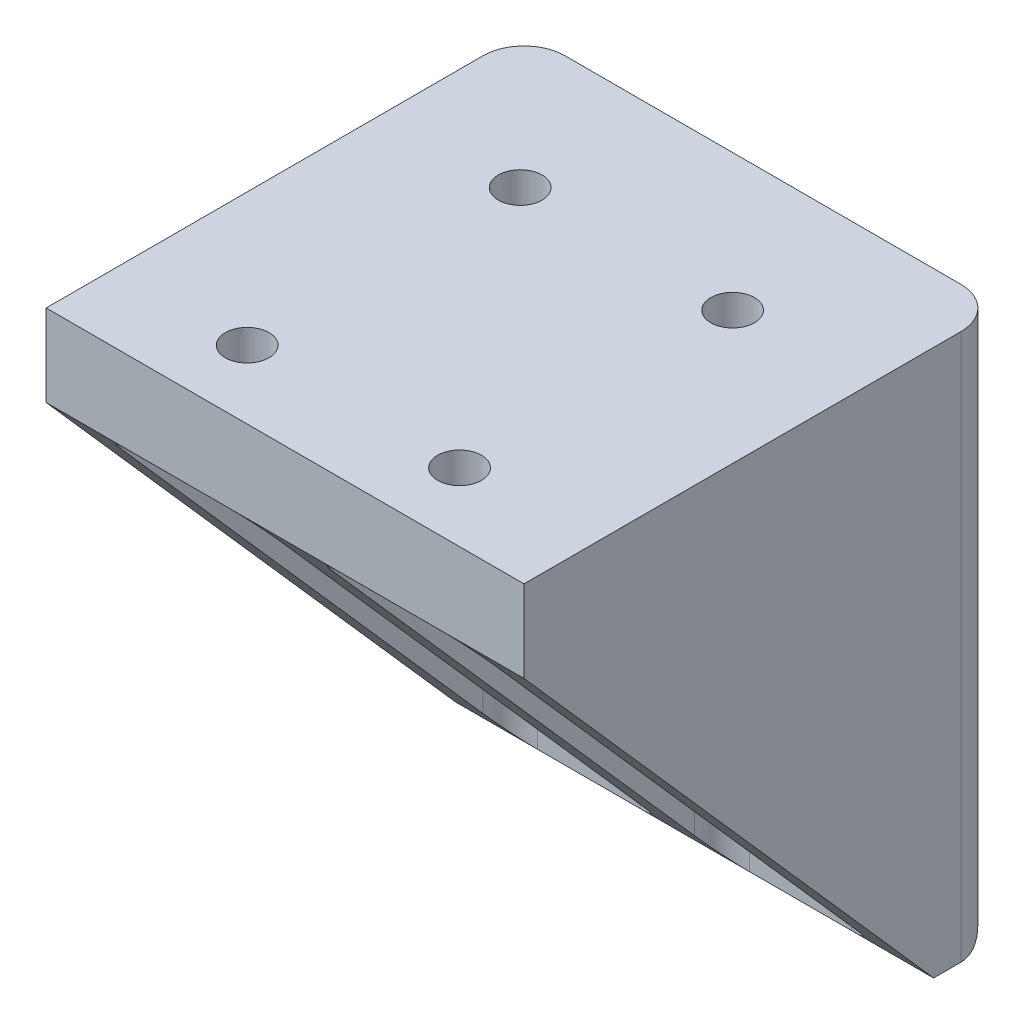
ISO-10303-21;
HEADER;
FILE_DESCRIPTION(('STEP AP214'),'2;1');
FILE_NAME('part.step','',(''),(''),'','','');
FILE_SCHEMA(('AUTOMOTIVE_DESIGN { 1 0 10303 214 1 1 1 1 }'));
ENDSEC;
DATA;
#1=APPLICATION_CONTEXT('core data for automotive mechanical design processes');
#2=APPLICATION_PROTOCOL_DEFINITION('international standard','automotive_design',2000,#1);
#3=PRODUCT_CONTEXT('',#1,'mechanical');
#4=PRODUCT('Part','Part','',(#3));
#5=PRODUCT_RELATED_PRODUCT_CATEGORY('part','',(#4));
#6=PRODUCT_DEFINITION_FORMATION('','',#4);
#7=PRODUCT_DEFINITION_CONTEXT('part definition',#1,'design');
#8=PRODUCT_DEFINITION('design','',#6,#7);
#9=PRODUCT_DEFINITION_SHAPE('','',#8);
#10=(LENGTH_UNIT() NAMED_UNIT(*) SI_UNIT(.MILLI.,.METRE.));
#11=(NAMED_UNIT(*) PLANE_ANGLE_UNIT() SI_UNIT($,.RADIAN.));
#12=(NAMED_UNIT(*) SI_UNIT($,.STERADIAN.) SOLID_ANGLE_UNIT());
#13=UNCERTAINTY_MEASURE_WITH_UNIT(LENGTH_MEASURE(1.E-05),#10,'distance_accuracy_value','');
#14=(GEOMETRIC_REPRESENTATION_CONTEXT(3) GLOBAL_UNCERTAINTY_ASSIGNED_CONTEXT((#13)) GLOBAL_UNIT_ASSIGNED_CONTEXT((#10,
#11,#12)) REPRESENTATION_CONTEXT('',''));
#15=CARTESIAN_POINT('',(0.,0.,0.));
#16=DIRECTION('',(0.,0.,1.));
#17=DIRECTION('',(1.,0.,0.));
#18=AXIS2_PLACEMENT_3D('',#15,#16,#17);
#19=CARTESIAN_POINT('',(0.,0.,5.));
#20=DIRECTION('',(0.,0.,-1.));
#21=DIRECTION('',(-1.,0.,0.));
#22=AXIS2_PLACEMENT_3D('',#19,#20,#21);
#23=PLANE('',#22);
#24=CARTESIAN_POINT('',(7.77817459305208,-7.778174593052,5.));
#25=DIRECTION('',(0.,0.,-1.));
#26=DIRECTION('',(-1.,0.,0.));
#27=AXIS2_PLACEMENT_3D('',#24,#25,#26);
#28=CIRCLE('',#27,1.05);
#29=CARTESIAN_POINT('',(6.72817459305208,-7.778174593052,5.));
#30=VERTEX_POINT('',#29);
#31=EDGE_CURVE('E327',#30,#30,#28,.T.);
#32=ORIENTED_EDGE('',*,*,#31,.T.);
#33=EDGE_LOOP('',(#32));
#34=FACE_BOUND('',#33,.T.);
#35=CARTESIAN_POINT('',(7.77817459305209,7.77817459305206,5.));
#36=DIRECTION('',(0.,0.,-1.));
#37=DIRECTION('',(-1.,0.,0.));
#38=AXIS2_PLACEMENT_3D('',#35,#36,#37);
#39=CIRCLE('',#38,1.05);
#40=CARTESIAN_POINT('',(6.72817459305209,7.77817459305206,5.));
#41=VERTEX_POINT('',#40);
#42=EDGE_CURVE('E320',#41,#41,#39,.T.);
#43=ORIENTED_EDGE('',*,*,#42,.T.);
#44=EDGE_LOOP('',(#43));
#45=FACE_BOUND('',#44,.T.);
#46=DIRECTION('',(1.,0.,0.));
#47=VECTOR('',#46,1.);
#48=CARTESIAN_POINT('',(-17.5,-20.,5.));
#49=LINE('',#48,#47);
#50=CARTESIAN_POINT('',(4.,-20.,5.));
#51=VERTEX_POINT('',#50);
#52=CARTESIAN_POINT('',(11.5,-20.,5.));
#53=VERTEX_POINT('',#52);
#54=EDGE_CURVE('E280',#51,#53,#49,.T.);
#55=ORIENTED_EDGE('',*,*,#54,.T.);
#56=DIRECTION('',(0.,1.,0.));
#57=VECTOR('',#56,1.);
#58=CARTESIAN_POINT('',(11.5,0.,5.));
#59=LINE('',#58,#57);
#60=CARTESIAN_POINT('',(11.5,14.,5.));
#61=VERTEX_POINT('',#60);
#62=EDGE_CURVE('E202',#53,#61,#59,.T.);
#63=ORIENTED_EDGE('',*,*,#62,.T.);
#64=DIRECTION('',(-1.,0.,0.));
#65=VECTOR('',#64,1.);
#66=CARTESIAN_POINT('',(-17.5,14.,5.));
#67=LINE('',#66,#65);
#68=CARTESIAN_POINT('',(4.,14.,5.));
#69=VERTEX_POINT('',#68);
#70=EDGE_CURVE('E287',#61,#69,#67,.T.);
#71=ORIENTED_EDGE('',*,*,#70,.T.);
#72=DIRECTION('',(0.,1.,0.));
#73=VECTOR('',#72,1.);
#74=CARTESIAN_POINT('',(4.,-20.,5.));
#75=LINE('',#74,#73);
#76=EDGE_CURVE('E157',#69,#51,#75,.F.);
#77=ORIENTED_EDGE('',*,*,#76,.T.);
#78=EDGE_LOOP('',(#55,#63,#71,#77));
#79=FACE_BOUND('',#78,.T.);
#80=ADVANCED_FACE('F43',(#34,#45,#79),#23,.F.);
#81=CARTESIAN_POINT('',(0.,14.,0.));
#82=DIRECTION('',(0.,1.,0.));
#83=DIRECTION('',(-1.,0.,0.));
#84=AXIS2_PLACEMENT_3D('',#81,#82,#83);
#85=PLANE('',#84);
#86=CARTESIAN_POINT('',(7.77817459305209,14.,10.));
#87=DIRECTION('',(0.,1.,0.));
#88=DIRECTION('',(-1.,0.,0.));
#89=AXIS2_PLACEMENT_3D('',#86,#87,#88);
#90=CIRCLE('',#89,1.6);
#91=CARTESIAN_POINT('',(6.17817459305209,14.,10.));
#92=VERTEX_POINT('',#91);
#93=EDGE_CURVE('E331',#92,#92,#90,.T.);
#94=ORIENTED_EDGE('',*,*,#93,.T.);
#95=EDGE_LOOP('',(#94));
#96=FACE_BOUND('',#95,.T.);
#97=CARTESIAN_POINT('',(7.77817459305209,14.,30.));
#98=DIRECTION('',(0.,1.,0.));
#99=DIRECTION('',(-1.,0.,0.));
#100=AXIS2_PLACEMENT_3D('',#97,#98,#99);
#101=CIRCLE('',#100,1.6);
#102=CARTESIAN_POINT('',(6.17817459305209,14.,30.));
#103=VERTEX_POINT('',#102);
#104=EDGE_CURVE('E261',#103,#103,#101,.T.);
#105=ORIENTED_EDGE('',*,*,#104,.T.);
#106=EDGE_LOOP('',(#105));
#107=FACE_BOUND('',#106,.T.);
#108=DIRECTION('',(1.,0.,0.));
#109=VECTOR('',#108,1.);
#110=CARTESIAN_POINT('',(-17.5,14.,35.));
#111=LINE('',#110,#109);
#112=CARTESIAN_POINT('',(4.,14.,35.));
#113=VERTEX_POINT('',#112);
#114=CARTESIAN_POINT('',(11.5,14.,35.));
#115=VERTEX_POINT('',#114);
#116=EDGE_CURVE('E293',#113,#115,#111,.T.);
#117=ORIENTED_EDGE('',*,*,#116,.F.);
#118=DIRECTION('',(0.,0.,1.));
#119=VECTOR('',#118,1.);
#120=CARTESIAN_POINT('',(4.,14.,5.));
#121=LINE('',#120,#119);
#122=EDGE_CURVE('E166',#113,#69,#121,.F.);
#123=ORIENTED_EDGE('',*,*,#122,.T.);
#124=ORIENTED_EDGE('',*,*,#70,.F.);
#125=DIRECTION('',(0.,0.,1.));
#126=VECTOR('',#125,1.);
#127=CARTESIAN_POINT('',(11.5,14.,0.));
#128=LINE('',#127,#126);
#129=EDGE_CURVE('E170',#61,#115,#128,.T.);
#130=ORIENTED_EDGE('',*,*,#129,.T.);
#131=EDGE_LOOP('',(#117,#123,#124,#130));
#132=FACE_BOUND('',#131,.T.);
#133=ADVANCED_FACE('F458',(#96,#107,#132),#85,.F.);
#134=CARTESIAN_POINT('',(17.5,-20.,5.));
#135=DIRECTION('',(-1.,0.,0.));
#136=DIRECTION('',(0.,0.,1.));
#137=AXIS2_PLACEMENT_3D('',#134,#135,#136);
#138=PLANE('',#137);
#139=DIRECTION('',(0.,0.,-1.));
#140=VECTOR('',#139,1.);
#141=CARTESIAN_POINT('',(17.5,-20.,5.));
#142=LINE('',#141,#140);
#143=CARTESIAN_POINT('',(17.5,-20.,5.));
#144=VERTEX_POINT('',#143);
#145=CARTESIAN_POINT('',(17.5,-20.,3.));
#146=VERTEX_POINT('',#145);
#147=EDGE_CURVE('E274',#144,#146,#142,.T.);
#148=ORIENTED_EDGE('',*,*,#147,.T.);
#149=DIRECTION('',(0.,1.,0.));
#150=VECTOR('',#149,1.);
#151=CARTESIAN_POINT('',(17.5,20.,3.));
#152=LINE('',#151,#150);
#153=CARTESIAN_POINT('',(17.5,20.,3.));
#154=VERTEX_POINT('',#153);
#155=EDGE_CURVE('E227',#146,#154,#152,.T.);
#156=ORIENTED_EDGE('',*,*,#155,.T.);
#157=DIRECTION('',(0.,0.,-1.));
#158=VECTOR('',#157,1.);
#159=CARTESIAN_POINT('',(17.5,20.,5.));
#160=LINE('',#159,#158);
#161=CARTESIAN_POINT('',(17.5,20.,35.));
#162=VERTEX_POINT('',#161);
#163=EDGE_CURVE('E257',#162,#154,#160,.T.);
#164=ORIENTED_EDGE('',*,*,#163,.F.);
#165=DIRECTION('',(0.,1.,0.));
#166=VECTOR('',#165,1.);
#167=CARTESIAN_POINT('',(17.5,14.,35.));
#168=LINE('',#167,#166);
#169=CARTESIAN_POINT('',(17.5,14.,35.));
#170=VERTEX_POINT('',#169);
#171=EDGE_CURVE('E281',#170,#162,#168,.T.);
#172=ORIENTED_EDGE('',*,*,#171,.F.);
#173=DIRECTION('',(0.,-0.749837855365092,-0.661621637086846));
#174=VECTOR('',#173,1.);
#175=CARTESIAN_POINT('',(17.5,14.,35.));
#176=LINE('',#175,#174);
#177=EDGE_CURVE('E303',#170,#144,#176,.T.);
#178=ORIENTED_EDGE('',*,*,#177,.T.);
#179=EDGE_LOOP('',(#148,#156,#164,#172,#178));
#180=FACE_BOUND('',#179,.T.);
#181=ADVANCED_FACE('F367',(#180),#138,.F.);
#182=CARTESIAN_POINT('',(-17.5,20.,5.));
#183=DIRECTION('',(0.,-1.,0.));
#184=DIRECTION('',(1.,0.,0.));
#185=AXIS2_PLACEMENT_3D('',#182,#183,#184);
#186=PLANE('',#185);
#187=CARTESIAN_POINT('',(7.77817459305209,20.,10.));
#188=DIRECTION('',(0.,1.,0.));
#189=DIRECTION('',(-1.,0.,0.));
#190=AXIS2_PLACEMENT_3D('',#187,#188,#189);
#191=CIRCLE('',#190,1.6);
#192=CARTESIAN_POINT('',(6.17817459305209,20.,10.));
#193=VERTEX_POINT('',#192);
#194=EDGE_CURVE('E231',#193,#193,#191,.T.);
#195=ORIENTED_EDGE('',*,*,#194,.F.);
#196=EDGE_LOOP('',(#195));
#197=FACE_BOUND('',#196,.T.);
#198=CARTESIAN_POINT('',(7.77817459305209,20.,30.));
#199=DIRECTION('',(0.,1.,0.));
#200=DIRECTION('',(-1.,0.,0.));
#201=AXIS2_PLACEMENT_3D('',#198,#199,#200);
#202=CIRCLE('',#201,1.6);
#203=CARTESIAN_POINT('',(6.17817459305209,20.,30.));
#204=VERTEX_POINT('',#203);
#205=EDGE_CURVE('E354',#204,#204,#202,.T.);
#206=ORIENTED_EDGE('',*,*,#205,.F.);
#207=EDGE_LOOP('',(#206));
#208=FACE_BOUND('',#207,.T.);
#209=CARTESIAN_POINT('',(-7.77817459305214,20.,30.));
#210=DIRECTION('',(0.,1.,0.));
#211=DIRECTION('',(-1.,0.,0.));
#212=AXIS2_PLACEMENT_3D('',#209,#210,#211);
#213=CIRCLE('',#212,1.6);
#214=CARTESIAN_POINT('',(-9.37817459305214,20.,30.));
#215=VERTEX_POINT('',#214);
#216=EDGE_CURVE('E351',#215,#215,#213,.T.);
#217=ORIENTED_EDGE('',*,*,#216,.F.);
#218=EDGE_LOOP('',(#217));
#219=FACE_BOUND('',#218,.T.);
#220=CARTESIAN_POINT('',(-7.77817459305214,20.,10.));
#221=DIRECTION('',(0.,1.,0.));
#222=DIRECTION('',(-1.,0.,0.));
#223=AXIS2_PLACEMENT_3D('',#220,#221,#222);
#224=CIRCLE('',#223,1.6);
#225=CARTESIAN_POINT('',(-9.37817459305214,20.,10.));
#226=VERTEX_POINT('',#225);
#227=EDGE_CURVE('E265',#226,#226,#224,.T.);
#228=ORIENTED_EDGE('',*,*,#227,.F.);
#229=EDGE_LOOP('',(#228));
#230=FACE_BOUND('',#229,.T.);
#231=DIRECTION('',(-1.,0.,0.));
#232=VECTOR('',#231,1.);
#233=CARTESIAN_POINT('',(-17.5,20.,0.));
#234=LINE('',#233,#232);
#235=CARTESIAN_POINT('',(14.5,20.,0.));
#236=VERTEX_POINT('',#235);
#237=CARTESIAN_POINT('',(-14.5,20.,0.));
#238=VERTEX_POINT('',#237);
#239=EDGE_CURVE('E277',#236,#238,#234,.T.);
#240=ORIENTED_EDGE('',*,*,#239,.T.);
#241=CARTESIAN_POINT('',(-14.5,20.,3.));
#242=DIRECTION('',(0.,-1.,0.));
#243=DIRECTION('',(1.,0.,0.));
#244=AXIS2_PLACEMENT_3D('',#241,#242,#243);
#245=CIRCLE('',#244,3.);
#246=CARTESIAN_POINT('',(-17.5,20.,3.));
#247=VERTEX_POINT('',#246);
#248=EDGE_CURVE('E236',#238,#247,#245,.F.);
#249=ORIENTED_EDGE('',*,*,#248,.T.);
#250=DIRECTION('',(0.,0.,-1.));
#251=VECTOR('',#250,1.);
#252=CARTESIAN_POINT('',(-17.5,20.,5.));
#253=LINE('',#252,#251);
#254=CARTESIAN_POINT('',(-17.5,20.,35.));
#255=VERTEX_POINT('',#254);
#256=EDGE_CURVE('E268',#255,#247,#253,.T.);
#257=ORIENTED_EDGE('',*,*,#256,.F.);
#258=DIRECTION('',(1.,0.,0.));
#259=VECTOR('',#258,1.);
#260=CARTESIAN_POINT('',(-17.5,20.,35.));
#261=LINE('',#260,#259);
#262=EDGE_CURVE('E290',#255,#162,#261,.T.);
#263=ORIENTED_EDGE('',*,*,#262,.T.);
#264=ORIENTED_EDGE('',*,*,#163,.T.);
#265=CARTESIAN_POINT('',(14.5,20.,3.));
#266=DIRECTION('',(0.,-1.,0.));
#267=DIRECTION('',(1.,0.,0.));
#268=AXIS2_PLACEMENT_3D('',#265,#266,#267);
#269=CIRCLE('',#268,3.);
#270=EDGE_CURVE('E239',#154,#236,#269,.F.);
#271=ORIENTED_EDGE('',*,*,#270,.T.);
#272=EDGE_LOOP('',(#240,#249,#257,#263,#264,#271));
#273=FACE_BOUND('',#272,.T.);
#274=ADVANCED_FACE('F363',(#197,#208,#219,#230,#273),#186,.F.);
#275=CARTESIAN_POINT('',(-17.5,-20.,5.));
#276=DIRECTION('',(1.,0.,0.));
#277=DIRECTION('',(0.,0.,-1.));
#278=AXIS2_PLACEMENT_3D('',#275,#276,#277);
#279=PLANE('',#278);
#280=ORIENTED_EDGE('',*,*,#256,.T.);
#281=DIRECTION('',(0.,-1.,0.));
#282=VECTOR('',#281,1.);
#283=CARTESIAN_POINT('',(-17.5,-20.,3.));
#284=LINE('',#283,#282);
#285=CARTESIAN_POINT('',(-17.5,-20.,3.));
#286=VERTEX_POINT('',#285);
#287=EDGE_CURVE('E242',#247,#286,#284,.T.);
#288=ORIENTED_EDGE('',*,*,#287,.T.);
#289=DIRECTION('',(0.,0.,-1.));
#290=VECTOR('',#289,1.);
#291=CARTESIAN_POINT('',(-17.5,-20.,5.));
#292=LINE('',#291,#290);
#293=CARTESIAN_POINT('',(-17.5,-20.,5.));
#294=VERTEX_POINT('',#293);
#295=EDGE_CURVE('E271',#294,#286,#292,.T.);
#296=ORIENTED_EDGE('',*,*,#295,.F.);
#297=DIRECTION('',(0.,-0.749837855365092,-0.661621637086846));
#298=VECTOR('',#297,1.);
#299=CARTESIAN_POINT('',(-17.5,14.,35.));
#300=LINE('',#299,#298);
#301=CARTESIAN_POINT('',(-17.5,14.,35.));
#302=VERTEX_POINT('',#301);
#303=EDGE_CURVE('E308',#302,#294,#300,.T.);
#304=ORIENTED_EDGE('',*,*,#303,.F.);
#305=DIRECTION('',(0.,1.,0.));
#306=VECTOR('',#305,1.);
#307=CARTESIAN_POINT('',(-17.5,14.,35.));
#308=LINE('',#307,#306);
#309=EDGE_CURVE('E284',#302,#255,#308,.T.);
#310=ORIENTED_EDGE('',*,*,#309,.T.);
#311=EDGE_LOOP('',(#280,#288,#296,#304,#310));
#312=FACE_BOUND('',#311,.T.);
#313=ADVANCED_FACE('F366',(#312),#279,.F.);
#314=CARTESIAN_POINT('',(-17.5,-20.,5.));
#315=DIRECTION('',(0.,1.,0.));
#316=DIRECTION('',(0.,0.,1.));
#317=AXIS2_PLACEMENT_3D('',#314,#315,#316);
#318=PLANE('',#317);
#319=ORIENTED_EDGE('',*,*,#295,.T.);
#320=DIRECTION('',(1.,0.,0.));
#321=VECTOR('',#320,1.);
#322=CARTESIAN_POINT('',(17.5,-20.,3.));
#323=LINE('',#322,#321);
#324=EDGE_CURVE('E254',#286,#146,#323,.T.);
#325=ORIENTED_EDGE('',*,*,#324,.T.);
#326=ORIENTED_EDGE('',*,*,#147,.F.);
#327=DIRECTION('',(1.,0.,0.));
#328=VECTOR('',#327,1.);
#329=CARTESIAN_POINT('',(13.5,-20.,5.));
#330=LINE('',#329,#328);
#331=EDGE_CURVE('E67',#53,#144,#330,.T.);
#332=ORIENTED_EDGE('',*,*,#331,.F.);
#333=ORIENTED_EDGE('',*,*,#54,.F.);
#334=DIRECTION('',(1.,0.,0.));
#335=VECTOR('',#334,1.);
#336=CARTESIAN_POINT('',(-2.,-20.,5.));
#337=LINE('',#336,#335);
#338=CARTESIAN_POINT('',(-4.,-20.,5.));
#339=VERTEX_POINT('',#338);
#340=EDGE_CURVE('E60',#339,#51,#337,.T.);
#341=ORIENTED_EDGE('',*,*,#340,.F.);
#342=CARTESIAN_POINT('',(-11.5,-20.,5.));
#343=VERTEX_POINT('',#342);
#344=EDGE_CURVE('E283',#343,#339,#49,.T.);
#345=ORIENTED_EDGE('',*,*,#344,.F.);
#346=EDGE_CURVE('E83',#294,#343,#49,.T.);
#347=ORIENTED_EDGE('',*,*,#346,.F.);
#348=EDGE_LOOP('',(#319,#325,#326,#332,#333,#341,#345,#347));
#349=FACE_BOUND('',#348,.T.);
#350=ADVANCED_FACE('F399',(#349),#318,.F.);
#351=CARTESIAN_POINT('',(-7.77817459305214,-7.7781745930519,5.));
#352=DIRECTION('',(0.,0.,-1.));
#353=DIRECTION('',(-1.,0.,0.));
#354=AXIS2_PLACEMENT_3D('',#351,#352,#353);
#355=CIRCLE('',#354,1.05);
#356=CARTESIAN_POINT('',(-8.82817459305214,-7.7781745930519,5.));
#357=VERTEX_POINT('',#356);
#358=EDGE_CURVE('E334',#357,#357,#355,.T.);
#359=ORIENTED_EDGE('',*,*,#358,.T.);
#360=EDGE_LOOP('',(#359));
#361=FACE_BOUND('',#360,.T.);
#362=CARTESIAN_POINT('',(-7.77817459305198,7.77817459305206,5.));
#363=DIRECTION('',(0.,0.,-1.));
#364=DIRECTION('',(-1.,0.,0.));
#365=AXIS2_PLACEMENT_3D('',#362,#363,#364);
#366=CIRCLE('',#365,1.05);
#367=CARTESIAN_POINT('',(-8.82817459305198,7.77817459305206,5.));
#368=VERTEX_POINT('',#367);
#369=EDGE_CURVE('E340',#368,#368,#366,.T.);
#370=ORIENTED_EDGE('',*,*,#369,.T.);
#371=EDGE_LOOP('',(#370));
#372=FACE_BOUND('',#371,.T.);
#373=CARTESIAN_POINT('',(-4.,14.,5.));
#374=VERTEX_POINT('',#373);
#375=CARTESIAN_POINT('',(-11.5,14.,5.));
#376=VERTEX_POINT('',#375);
#377=EDGE_CURVE('E296',#374,#376,#67,.T.);
#378=ORIENTED_EDGE('',*,*,#377,.T.);
#379=DIRECTION('',(0.,1.,0.));
#380=VECTOR('',#379,1.);
#381=CARTESIAN_POINT('',(-11.5,0.,5.));
#382=LINE('',#381,#380);
#383=EDGE_CURVE('E198',#376,#343,#382,.F.);
#384=ORIENTED_EDGE('',*,*,#383,.T.);
#385=ORIENTED_EDGE('',*,*,#344,.T.);
#386=DIRECTION('',(0.,1.,0.));
#387=VECTOR('',#386,1.);
#388=CARTESIAN_POINT('',(-4.,0.,5.));
#389=LINE('',#388,#387);
#390=EDGE_CURVE('E200',#339,#374,#389,.T.);
#391=ORIENTED_EDGE('',*,*,#390,.T.);
#392=EDGE_LOOP('',(#378,#384,#385,#391));
#393=FACE_BOUND('',#392,.T.);
#394=ADVANCED_FACE('F461',(#361,#372,#393),#23,.F.);
#395=CARTESIAN_POINT('',(0.,0.,0.));
#396=DIRECTION('',(0.,0.,-1.));
#397=DIRECTION('',(-1.,0.,0.));
#398=AXIS2_PLACEMENT_3D('',#395,#396,#397);
#399=PLANE('',#398);
#400=CARTESIAN_POINT('',(7.77817459305208,-7.778174593052,0.));
#401=DIRECTION('',(0.,0.,-1.));
#402=DIRECTION('',(-1.,0.,0.));
#403=AXIS2_PLACEMENT_3D('',#400,#401,#402);
#404=CIRCLE('',#403,1.05);
#405=CARTESIAN_POINT('',(6.72817459305208,-7.778174593052,0.));
#406=VERTEX_POINT('',#405);
#407=EDGE_CURVE('E330',#406,#406,#404,.T.);
#408=ORIENTED_EDGE('',*,*,#407,.F.);
#409=EDGE_LOOP('',(#408));
#410=FACE_BOUND('',#409,.T.);
#411=CARTESIAN_POINT('',(-7.77817459305214,-7.7781745930519,0.));
#412=DIRECTION('',(0.,0.,-1.));
#413=DIRECTION('',(-1.,0.,0.));
#414=AXIS2_PLACEMENT_3D('',#411,#412,#413);
#415=CIRCLE('',#414,1.05);
#416=CARTESIAN_POINT('',(-8.82817459305214,-7.7781745930519,0.));
#417=VERTEX_POINT('',#416);
#418=EDGE_CURVE('E337',#417,#417,#415,.T.);
#419=ORIENTED_EDGE('',*,*,#418,.F.);
#420=EDGE_LOOP('',(#419));
#421=FACE_BOUND('',#420,.T.);
#422=CARTESIAN_POINT('',(-7.77817459305198,7.77817459305206,0.));
#423=DIRECTION('',(0.,0.,-1.));
#424=DIRECTION('',(-1.,0.,0.));
#425=AXIS2_PLACEMENT_3D('',#422,#423,#424);
#426=CIRCLE('',#425,1.05);
#427=CARTESIAN_POINT('',(-8.82817459305198,7.77817459305206,0.));
#428=VERTEX_POINT('',#427);
#429=EDGE_CURVE('E324',#428,#428,#426,.T.);
#430=ORIENTED_EDGE('',*,*,#429,.F.);
#431=EDGE_LOOP('',(#430));
#432=FACE_BOUND('',#431,.T.);
#433=CARTESIAN_POINT('',(7.77817459305209,7.77817459305206,0.));
#434=DIRECTION('',(0.,0.,-1.));
#435=DIRECTION('',(-1.,0.,0.));
#436=AXIS2_PLACEMENT_3D('',#433,#434,#435);
#437=CIRCLE('',#436,1.05);
#438=CARTESIAN_POINT('',(6.72817459305209,7.77817459305206,0.));
#439=VERTEX_POINT('',#438);
#440=EDGE_CURVE('E321',#439,#439,#437,.T.);
#441=ORIENTED_EDGE('',*,*,#440,.F.);
#442=EDGE_LOOP('',(#441));
#443=FACE_BOUND('',#442,.T.);
#444=DIRECTION('',(1.,0.,0.));
#445=VECTOR('',#444,1.);
#446=CARTESIAN_POINT('',(-17.5,-17.,0.));
#447=LINE('',#446,#445);
#448=CARTESIAN_POINT('',(14.5,-17.,0.));
#449=VERTEX_POINT('',#448);
#450=CARTESIAN_POINT('',(-14.5,-17.,0.));
#451=VERTEX_POINT('',#450);
#452=EDGE_CURVE('E248',#449,#451,#447,.F.);
#453=ORIENTED_EDGE('',*,*,#452,.T.);
#454=DIRECTION('',(0.,-1.,0.));
#455=VECTOR('',#454,1.);
#456=CARTESIAN_POINT('',(-14.5,20.,0.));
#457=LINE('',#456,#455);
#458=EDGE_CURVE('E245',#451,#238,#457,.F.);
#459=ORIENTED_EDGE('',*,*,#458,.T.);
#460=ORIENTED_EDGE('',*,*,#239,.F.);
#461=DIRECTION('',(0.,1.,0.));
#462=VECTOR('',#461,1.);
#463=CARTESIAN_POINT('',(14.5,-20.,0.));
#464=LINE('',#463,#462);
#465=EDGE_CURVE('E251',#236,#449,#464,.F.);
#466=ORIENTED_EDGE('',*,*,#465,.T.);
#467=EDGE_LOOP('',(#453,#459,#460,#466));
#468=FACE_BOUND('',#467,.T.);
#469=ADVANCED_FACE('F445',(#410,#421,#432,#443,#468),#399,.T.);
#470=CARTESIAN_POINT('',(-17.5,14.,35.));
#471=DIRECTION('',(0.,0.,1.));
#472=DIRECTION('',(1.,0.,0.));
#473=AXIS2_PLACEMENT_3D('',#470,#471,#472);
#474=PLANE('',#473);
#475=ORIENTED_EDGE('',*,*,#262,.F.);
#476=ORIENTED_EDGE('',*,*,#309,.F.);
#477=CARTESIAN_POINT('',(-11.5,14.,35.));
#478=VERTEX_POINT('',#477);
#479=EDGE_CURVE('E91',#302,#478,#111,.T.);
#480=ORIENTED_EDGE('',*,*,#479,.T.);
#481=CARTESIAN_POINT('',(-4.,14.,35.));
#482=VERTEX_POINT('',#481);
#483=EDGE_CURVE('E298',#478,#482,#111,.T.);
#484=ORIENTED_EDGE('',*,*,#483,.T.);
#485=DIRECTION('',(1.,0.,0.));
#486=VECTOR('',#485,1.);
#487=CARTESIAN_POINT('',(-2.,14.,35.));
#488=LINE('',#487,#486);
#489=EDGE_CURVE('E103',#482,#113,#488,.T.);
#490=ORIENTED_EDGE('',*,*,#489,.T.);
#491=ORIENTED_EDGE('',*,*,#116,.T.);
#492=DIRECTION('',(1.,0.,0.));
#493=VECTOR('',#492,1.);
#494=CARTESIAN_POINT('',(13.5,14.,35.));
#495=LINE('',#494,#493);
#496=EDGE_CURVE('E299',#115,#170,#495,.T.);
#497=ORIENTED_EDGE('',*,*,#496,.T.);
#498=ORIENTED_EDGE('',*,*,#171,.T.);
#499=EDGE_LOOP('',(#475,#476,#480,#484,#490,#491,#497,#498));
#500=FACE_BOUND('',#499,.T.);
#501=ADVANCED_FACE('F437',(#500),#474,.T.);
#502=CARTESIAN_POINT('',(-7.77817459305214,14.,30.));
#503=DIRECTION('',(0.,1.,0.));
#504=DIRECTION('',(-1.,0.,0.));
#505=AXIS2_PLACEMENT_3D('',#502,#503,#504);
#506=CIRCLE('',#505,1.6);
#507=CARTESIAN_POINT('',(-9.37817459305214,14.,30.));
#508=VERTEX_POINT('',#507);
#509=EDGE_CURVE('E258',#508,#508,#506,.T.);
#510=ORIENTED_EDGE('',*,*,#509,.T.);
#511=EDGE_LOOP('',(#510));
#512=FACE_BOUND('',#511,.T.);
#513=CARTESIAN_POINT('',(-7.77817459305214,14.,10.));
#514=DIRECTION('',(0.,1.,0.));
#515=DIRECTION('',(-1.,0.,0.));
#516=AXIS2_PLACEMENT_3D('',#513,#514,#515);
#517=CIRCLE('',#516,1.6);
#518=CARTESIAN_POINT('',(-9.37817459305214,14.,10.));
#519=VERTEX_POINT('',#518);
#520=EDGE_CURVE('E262',#519,#519,#517,.T.);
#521=ORIENTED_EDGE('',*,*,#520,.T.);
#522=EDGE_LOOP('',(#521));
#523=FACE_BOUND('',#522,.T.);
#524=ORIENTED_EDGE('',*,*,#483,.F.);
#525=DIRECTION('',(0.,0.,1.));
#526=VECTOR('',#525,1.);
#527=CARTESIAN_POINT('',(-11.5,14.,0.));
#528=LINE('',#527,#526);
#529=EDGE_CURVE('E113',#478,#376,#528,.F.);
#530=ORIENTED_EDGE('',*,*,#529,.T.);
#531=ORIENTED_EDGE('',*,*,#377,.F.);
#532=DIRECTION('',(0.,0.,1.));
#533=VECTOR('',#532,1.);
#534=CARTESIAN_POINT('',(-4.,14.,0.));
#535=LINE('',#534,#533);
#536=EDGE_CURVE('E218',#374,#482,#535,.T.);
#537=ORIENTED_EDGE('',*,*,#536,.T.);
#538=EDGE_LOOP('',(#524,#530,#531,#537));
#539=FACE_BOUND('',#538,.T.);
#540=ADVANCED_FACE('F467',(#512,#523,#539),#85,.F.);
#541=CARTESIAN_POINT('',(13.5,14.,35.));
#542=DIRECTION('',(0.,-0.661621637086847,0.749837855365093));
#543=DIRECTION('',(0.,-0.749837855365092,-0.661621637086847));
#544=AXIS2_PLACEMENT_3D('',#541,#542,#543);
#545=PLANE('',#544);
#546=ORIENTED_EDGE('',*,*,#177,.F.);
#547=ORIENTED_EDGE('',*,*,#496,.F.);
#548=CARTESIAN_POINT('',(11.5,12.,33.2352941176471));
#549=DIRECTION('',(0.,-0.661621637086847,0.749837855365093));
#550=DIRECTION('',(0.,0.749837855365092,0.661621637086847));
#551=AXIS2_PLACEMENT_3D('',#548,#549,#550);
#552=ELLIPSE('',#551,2.66724330558933,2.);
#553=CARTESIAN_POINT('',(13.5,12.,33.2352941176471));
#554=VERTEX_POINT('',#553);
#555=EDGE_CURVE('E189',#115,#554,#552,.F.);
#556=ORIENTED_EDGE('',*,*,#555,.T.);
#557=DIRECTION('',(0.,-0.749837855365092,-0.661621637086846));
#558=VECTOR('',#557,1.);
#559=CARTESIAN_POINT('',(13.5,14.,35.));
#560=LINE('',#559,#558);
#561=CARTESIAN_POINT('',(13.5,-17.7333333333333,7.00000000000001));
#562=VERTEX_POINT('',#561);
#563=EDGE_CURVE('E153',#554,#562,#560,.T.);
#564=ORIENTED_EDGE('',*,*,#563,.T.);
#565=CARTESIAN_POINT('',(11.5,-17.7333333333333,7.));
#566=DIRECTION('',(0.,-0.661621637086847,0.749837855365093));
#567=DIRECTION('',(0.,0.749837855365092,0.661621637086847));
#568=AXIS2_PLACEMENT_3D('',#565,#566,#567);
#569=ELLIPSE('',#568,3.02287574633457,2.);
#570=EDGE_CURVE('E165',#562,#53,#569,.F.);
#571=ORIENTED_EDGE('',*,*,#570,.T.);
#572=ORIENTED_EDGE('',*,*,#331,.T.);
#573=EDGE_LOOP('',(#546,#547,#556,#564,#571,#572));
#574=FACE_BOUND('',#573,.T.);
#575=ADVANCED_FACE('F517',(#574),#545,.T.);
#576=CARTESIAN_POINT('',(13.5,0.,0.));
#577=DIRECTION('',(-1.,0.,0.));
#578=DIRECTION('',(0.,0.,1.));
#579=AXIS2_PLACEMENT_3D('',#576,#577,#578);
#580=PLANE('',#579);
#581=ORIENTED_EDGE('',*,*,#563,.F.);
#582=DIRECTION('',(0.,0.,1.));
#583=VECTOR('',#582,1.);
#584=CARTESIAN_POINT('',(13.5,12.,0.));
#585=LINE('',#584,#583);
#586=CARTESIAN_POINT('',(13.5,12.,7.));
#587=VERTEX_POINT('',#586);
#588=EDGE_CURVE('E151',#554,#587,#585,.F.);
#589=ORIENTED_EDGE('',*,*,#588,.T.);
#590=DIRECTION('',(0.,1.,0.));
#591=VECTOR('',#590,1.);
#592=CARTESIAN_POINT('',(13.5,0.,7.));
#593=LINE('',#592,#591);
#594=EDGE_CURVE('E148',#587,#562,#593,.F.);
#595=ORIENTED_EDGE('',*,*,#594,.T.);
#596=EDGE_LOOP('',(#581,#589,#595));
#597=FACE_BOUND('',#596,.T.);
#598=ADVANCED_FACE('F152',(#597),#580,.T.);
#599=CARTESIAN_POINT('',(-13.5,14.,35.));
#600=DIRECTION('',(0.,0.661621637086847,-0.749837855365093));
#601=DIRECTION('',(0.,0.749837855365092,0.661621637086847));
#602=AXIS2_PLACEMENT_3D('',#599,#600,#601);
#603=PLANE('',#602);
#604=ORIENTED_EDGE('',*,*,#303,.T.);
#605=ORIENTED_EDGE('',*,*,#346,.T.);
#606=CARTESIAN_POINT('',(-11.5,-17.7333333333333,7.));
#607=DIRECTION('',(0.,0.661621637086847,-0.749837855365093));
#608=DIRECTION('',(0.,0.749837855365092,0.661621637086847));
#609=AXIS2_PLACEMENT_3D('',#606,#607,#608);
#610=ELLIPSE('',#609,3.02287574633457,2.);
#611=CARTESIAN_POINT('',(-13.5,-17.7333333333333,7.00000000000001));
#612=VERTEX_POINT('',#611);
#613=EDGE_CURVE('E52',#343,#612,#610,.T.);
#614=ORIENTED_EDGE('',*,*,#613,.T.);
#615=DIRECTION('',(0.,-0.749837855365092,-0.661621637086846));
#616=VECTOR('',#615,1.);
#617=CARTESIAN_POINT('',(-13.5,14.,35.));
#618=LINE('',#617,#616);
#619=CARTESIAN_POINT('',(-13.5,12.,33.2352941176471));
#620=VERTEX_POINT('',#619);
#621=EDGE_CURVE('E306',#620,#612,#618,.T.);
#622=ORIENTED_EDGE('',*,*,#621,.F.);
#623=CARTESIAN_POINT('',(-11.5,12.,33.2352941176471));
#624=DIRECTION('',(0.,0.661621637086847,-0.749837855365093));
#625=DIRECTION('',(0.,0.749837855365092,0.661621637086847));
#626=AXIS2_PLACEMENT_3D('',#623,#624,#625);
#627=ELLIPSE('',#626,2.66724330558933,2.);
#628=EDGE_CURVE('E195',#620,#478,#627,.T.);
#629=ORIENTED_EDGE('',*,*,#628,.T.);
#630=ORIENTED_EDGE('',*,*,#479,.F.);
#631=EDGE_LOOP('',(#604,#605,#614,#622,#629,#630));
#632=FACE_BOUND('',#631,.T.);
#633=ADVANCED_FACE('F435',(#632),#603,.F.);
#634=CARTESIAN_POINT('',(-13.5,0.,0.));
#635=DIRECTION('',(1.,0.,0.));
#636=DIRECTION('',(0.,0.,1.));
#637=AXIS2_PLACEMENT_3D('',#634,#635,#636);
#638=PLANE('',#637);
#639=DIRECTION('',(0.,1.,0.));
#640=VECTOR('',#639,1.);
#641=CARTESIAN_POINT('',(-13.5,0.,7.));
#642=LINE('',#641,#640);
#643=CARTESIAN_POINT('',(-13.5,12.,7.));
#644=VERTEX_POINT('',#643);
#645=EDGE_CURVE('E224',#612,#644,#642,.T.);
#646=ORIENTED_EDGE('',*,*,#645,.T.);
#647=DIRECTION('',(0.,0.,1.));
#648=VECTOR('',#647,1.);
#649=CARTESIAN_POINT('',(-13.5,12.,0.));
#650=LINE('',#649,#648);
#651=EDGE_CURVE('E221',#644,#620,#650,.T.);
#652=ORIENTED_EDGE('',*,*,#651,.T.);
#653=ORIENTED_EDGE('',*,*,#621,.T.);
#654=EDGE_LOOP('',(#646,#652,#653));
#655=FACE_BOUND('',#654,.T.);
#656=ADVANCED_FACE('F427',(#655),#638,.T.);
#657=CARTESIAN_POINT('',(-2.,14.,35.));
#658=DIRECTION('',(0.,-0.661621637086847,0.749837855365093));
#659=DIRECTION('',(0.,-0.749837855365092,-0.661621637086847));
#660=AXIS2_PLACEMENT_3D('',#657,#658,#659);
#661=PLANE('',#660);
#662=ORIENTED_EDGE('',*,*,#340,.T.);
#663=CARTESIAN_POINT('',(4.,-17.7333333333333,7.));
#664=DIRECTION('',(0.,-0.661621637086847,0.749837855365093));
#665=DIRECTION('',(0.,-0.749837855365092,-0.661621637086847));
#666=AXIS2_PLACEMENT_3D('',#663,#664,#665);
#667=ELLIPSE('',#666,3.02287574633457,2.);
#668=CARTESIAN_POINT('',(2.,-17.7333333333333,7.00000000000001));
#669=VERTEX_POINT('',#668);
#670=EDGE_CURVE('E186',#51,#669,#667,.F.);
#671=ORIENTED_EDGE('',*,*,#670,.T.);
#672=DIRECTION('',(0.,-0.749837855365092,-0.661621637086846));
#673=VECTOR('',#672,1.);
#674=CARTESIAN_POINT('',(2.,14.,35.));
#675=LINE('',#674,#673);
#676=CARTESIAN_POINT('',(2.,12.,33.2352941176471));
#677=VERTEX_POINT('',#676);
#678=EDGE_CURVE('E317',#677,#669,#675,.T.);
#679=ORIENTED_EDGE('',*,*,#678,.F.);
#680=CARTESIAN_POINT('',(4.,12.,33.2352941176471));
#681=DIRECTION('',(0.,-0.661621637086847,0.749837855365093));
#682=DIRECTION('',(0.,-0.749837855365092,-0.661621637086847));
#683=AXIS2_PLACEMENT_3D('',#680,#681,#682);
#684=ELLIPSE('',#683,2.66724330558933,2.);
#685=EDGE_CURVE('E191',#677,#113,#684,.F.);
#686=ORIENTED_EDGE('',*,*,#685,.T.);
#687=ORIENTED_EDGE('',*,*,#489,.F.);
#688=CARTESIAN_POINT('',(-4.,12.,33.2352941176471));
#689=DIRECTION('',(0.,-0.661621637086847,0.749837855365093));
#690=DIRECTION('',(0.,0.749837855365092,0.661621637086847));
#691=AXIS2_PLACEMENT_3D('',#688,#689,#690);
#692=ELLIPSE('',#691,2.66724330558933,2.);
#693=CARTESIAN_POINT('',(-2.,12.,33.2352941176471));
#694=VERTEX_POINT('',#693);
#695=EDGE_CURVE('E193',#482,#694,#692,.F.);
#696=ORIENTED_EDGE('',*,*,#695,.T.);
#697=DIRECTION('',(0.,-0.749837855365092,-0.661621637086846));
#698=VECTOR('',#697,1.);
#699=CARTESIAN_POINT('',(-2.,14.,35.));
#700=LINE('',#699,#698);
#701=CARTESIAN_POINT('',(-2.,-17.7333333333333,7.00000000000001));
#702=VERTEX_POINT('',#701);
#703=EDGE_CURVE('E313',#694,#702,#700,.T.);
#704=ORIENTED_EDGE('',*,*,#703,.T.);
#705=CARTESIAN_POINT('',(-4.,-17.7333333333333,7.));
#706=DIRECTION('',(0.,-0.661621637086847,0.749837855365093));
#707=DIRECTION('',(0.,0.749837855365092,0.661621637086847));
#708=AXIS2_PLACEMENT_3D('',#705,#706,#707);
#709=ELLIPSE('',#708,3.02287574633457,2.);
#710=EDGE_CURVE('E11',#702,#339,#709,.F.);
#711=ORIENTED_EDGE('',*,*,#710,.T.);
#712=EDGE_LOOP('',(#662,#671,#679,#686,#687,#696,#704,#711));
#713=FACE_BOUND('',#712,.T.);
#714=ADVANCED_FACE('F495',(#713),#661,.T.);
#715=CARTESIAN_POINT('',(-2.,0.,0.));
#716=DIRECTION('',(-1.,0.,0.));
#717=DIRECTION('',(0.,0.,1.));
#718=AXIS2_PLACEMENT_3D('',#715,#716,#717);
#719=PLANE('',#718);
#720=ORIENTED_EDGE('',*,*,#703,.F.);
#721=DIRECTION('',(0.,0.,1.));
#722=VECTOR('',#721,1.);
#723=CARTESIAN_POINT('',(-2.,12.,0.));
#724=LINE('',#723,#722);
#725=CARTESIAN_POINT('',(-2.,12.,7.));
#726=VERTEX_POINT('',#725);
#727=EDGE_CURVE('E213',#694,#726,#724,.F.);
#728=ORIENTED_EDGE('',*,*,#727,.T.);
#729=DIRECTION('',(0.,1.,0.));
#730=VECTOR('',#729,1.);
#731=CARTESIAN_POINT('',(-2.,0.,7.));
#732=LINE('',#731,#730);
#733=EDGE_CURVE('E215',#726,#702,#732,.F.);
#734=ORIENTED_EDGE('',*,*,#733,.T.);
#735=EDGE_LOOP('',(#720,#728,#734));
#736=FACE_BOUND('',#735,.T.);
#737=ADVANCED_FACE('F497',(#736),#719,.T.);
#738=CARTESIAN_POINT('',(2.,0.,0.));
#739=DIRECTION('',(-1.,0.,0.));
#740=DIRECTION('',(0.,0.,1.));
#741=AXIS2_PLACEMENT_3D('',#738,#739,#740);
#742=PLANE('',#741);
#743=DIRECTION('',(0.,1.,0.));
#744=VECTOR('',#743,1.);
#745=CARTESIAN_POINT('',(2.,14.,7.));
#746=LINE('',#745,#744);
#747=CARTESIAN_POINT('',(2.,12.,7.));
#748=VERTEX_POINT('',#747);
#749=EDGE_CURVE('E211',#669,#748,#746,.T.);
#750=ORIENTED_EDGE('',*,*,#749,.T.);
#751=DIRECTION('',(0.,0.,1.));
#752=VECTOR('',#751,1.);
#753=CARTESIAN_POINT('',(2.,12.,35.));
#754=LINE('',#753,#752);
#755=EDGE_CURVE('E208',#748,#677,#754,.T.);
#756=ORIENTED_EDGE('',*,*,#755,.T.);
#757=ORIENTED_EDGE('',*,*,#678,.T.);
#758=EDGE_LOOP('',(#750,#756,#757));
#759=FACE_BOUND('',#758,.T.);
#760=ADVANCED_FACE('F499',(#759),#742,.F.);
#761=CARTESIAN_POINT('',(7.77817459305209,7.77817459305206,5.));
#762=DIRECTION('',(0.,0.,-1.));
#763=DIRECTION('',(-1.,0.,0.));
#764=AXIS2_PLACEMENT_3D('',#761,#762,#763);
#765=CYLINDRICAL_SURFACE('',#764,1.05);
#766=ORIENTED_EDGE('',*,*,#42,.F.);
#767=EDGE_LOOP('',(#766));
#768=FACE_BOUND('',#767,.T.);
#769=ORIENTED_EDGE('',*,*,#440,.T.);
#770=EDGE_LOOP('',(#769));
#771=FACE_BOUND('',#770,.T.);
#772=ADVANCED_FACE('F505',(#768,#771),#765,.F.);
#773=CARTESIAN_POINT('',(-7.77817459305198,7.77817459305206,5.));
#774=DIRECTION('',(0.,0.,-1.));
#775=DIRECTION('',(-1.,0.,0.));
#776=AXIS2_PLACEMENT_3D('',#773,#774,#775);
#777=CYLINDRICAL_SURFACE('',#776,1.05);
#778=ORIENTED_EDGE('',*,*,#369,.F.);
#779=EDGE_LOOP('',(#778));
#780=FACE_BOUND('',#779,.T.);
#781=ORIENTED_EDGE('',*,*,#429,.T.);
#782=EDGE_LOOP('',(#781));
#783=FACE_BOUND('',#782,.T.);
#784=ADVANCED_FACE('F581',(#780,#783),#777,.F.);
#785=CARTESIAN_POINT('',(-7.77817459305214,-7.7781745930519,5.));
#786=DIRECTION('',(0.,0.,-1.));
#787=DIRECTION('',(-1.,0.,0.));
#788=AXIS2_PLACEMENT_3D('',#785,#786,#787);
#789=CYLINDRICAL_SURFACE('',#788,1.05);
#790=ORIENTED_EDGE('',*,*,#358,.F.);
#791=EDGE_LOOP('',(#790));
#792=FACE_BOUND('',#791,.T.);
#793=ORIENTED_EDGE('',*,*,#418,.T.);
#794=EDGE_LOOP('',(#793));
#795=FACE_BOUND('',#794,.T.);
#796=ADVANCED_FACE('F590',(#792,#795),#789,.F.);
#797=CARTESIAN_POINT('',(7.77817459305208,-7.778174593052,5.));
#798=DIRECTION('',(0.,0.,-1.));
#799=DIRECTION('',(-1.,0.,0.));
#800=AXIS2_PLACEMENT_3D('',#797,#798,#799);
#801=CYLINDRICAL_SURFACE('',#800,1.05);
#802=ORIENTED_EDGE('',*,*,#31,.F.);
#803=EDGE_LOOP('',(#802));
#804=FACE_BOUND('',#803,.T.);
#805=ORIENTED_EDGE('',*,*,#407,.T.);
#806=EDGE_LOOP('',(#805));
#807=FACE_BOUND('',#806,.T.);
#808=ADVANCED_FACE('F600',(#804,#807),#801,.F.);
#809=CARTESIAN_POINT('',(-7.77817459305214,-20.,10.));
#810=DIRECTION('',(0.,1.,0.));
#811=DIRECTION('',(-1.,0.,0.));
#812=AXIS2_PLACEMENT_3D('',#809,#810,#811);
#813=CYLINDRICAL_SURFACE('',#812,1.6);
#814=ORIENTED_EDGE('',*,*,#227,.T.);
#815=EDGE_LOOP('',(#814));
#816=FACE_BOUND('',#815,.T.);
#817=ORIENTED_EDGE('',*,*,#520,.F.);
#818=EDGE_LOOP('',(#817));
#819=FACE_BOUND('',#818,.T.);
#820=ADVANCED_FACE('F610',(#816,#819),#813,.F.);
#821=CARTESIAN_POINT('',(-7.77817459305214,-20.,30.));
#822=DIRECTION('',(0.,1.,0.));
#823=DIRECTION('',(-1.,0.,0.));
#824=AXIS2_PLACEMENT_3D('',#821,#822,#823);
#825=CYLINDRICAL_SURFACE('',#824,1.6);
#826=ORIENTED_EDGE('',*,*,#216,.T.);
#827=EDGE_LOOP('',(#826));
#828=FACE_BOUND('',#827,.T.);
#829=ORIENTED_EDGE('',*,*,#509,.F.);
#830=EDGE_LOOP('',(#829));
#831=FACE_BOUND('',#830,.T.);
#832=ADVANCED_FACE('F360',(#828,#831),#825,.F.);
#833=CARTESIAN_POINT('',(7.77817459305208,-20.,30.));
#834=DIRECTION('',(0.,1.,0.));
#835=DIRECTION('',(-1.,0.,0.));
#836=AXIS2_PLACEMENT_3D('',#833,#834,#835);
#837=CYLINDRICAL_SURFACE('',#836,1.6);
#838=ORIENTED_EDGE('',*,*,#205,.T.);
#839=EDGE_LOOP('',(#838));
#840=FACE_BOUND('',#839,.T.);
#841=ORIENTED_EDGE('',*,*,#104,.F.);
#842=EDGE_LOOP('',(#841));
#843=FACE_BOUND('',#842,.T.);
#844=ADVANCED_FACE('F629',(#840,#843),#837,.F.);
#845=CARTESIAN_POINT('',(7.77817459305208,-20.,10.));
#846=DIRECTION('',(0.,1.,0.));
#847=DIRECTION('',(-1.,0.,0.));
#848=AXIS2_PLACEMENT_3D('',#845,#846,#847);
#849=CYLINDRICAL_SURFACE('',#848,1.6);
#850=ORIENTED_EDGE('',*,*,#194,.T.);
#851=EDGE_LOOP('',(#850));
#852=FACE_BOUND('',#851,.T.);
#853=ORIENTED_EDGE('',*,*,#93,.F.);
#854=EDGE_LOOP('',(#853));
#855=FACE_BOUND('',#854,.T.);
#856=ADVANCED_FACE('F638',(#852,#855),#849,.F.);
#857=CARTESIAN_POINT('',(-14.5,-20.,3.));
#858=DIRECTION('',(0.,1.,0.));
#859=DIRECTION('',(0.,0.,1.));
#860=AXIS2_PLACEMENT_3D('',#857,#858,#859);
#861=CYLINDRICAL_SURFACE('',#860,3.);
#862=ORIENTED_EDGE('',*,*,#248,.F.);
#863=ORIENTED_EDGE('',*,*,#458,.F.);
#864=CARTESIAN_POINT('',(-14.5,-17.,3.));
#865=DIRECTION('',(-0.707106781186547,0.707106781186547,0.));
#866=DIRECTION('',(0.707106781186547,0.707106781186547,0.));
#867=AXIS2_PLACEMENT_3D('',#864,#865,#866);
#868=ELLIPSE('',#867,4.24264068711928,3.);
#869=EDGE_CURVE('E228',#286,#451,#868,.F.);
#870=ORIENTED_EDGE('',*,*,#869,.F.);
#871=ORIENTED_EDGE('',*,*,#287,.F.);
#872=EDGE_LOOP('',(#862,#863,#870,#871));
#873=FACE_BOUND('',#872,.T.);
#874=ADVANCED_FACE('F386',(#873),#861,.T.);
#875=CARTESIAN_POINT('',(14.5,-20.,3.));
#876=DIRECTION('',(0.,-1.,0.));
#877=DIRECTION('',(0.,0.,-1.));
#878=AXIS2_PLACEMENT_3D('',#875,#876,#877);
#879=CYLINDRICAL_SURFACE('',#878,3.);
#880=ORIENTED_EDGE('',*,*,#270,.F.);
#881=ORIENTED_EDGE('',*,*,#155,.F.);
#882=CARTESIAN_POINT('',(14.5,-17.,3.));
#883=DIRECTION('',(-0.707106781186547,-0.707106781186547,0.));
#884=DIRECTION('',(0.707106781186547,-0.707106781186547,0.));
#885=AXIS2_PLACEMENT_3D('',#882,#883,#884);
#886=ELLIPSE('',#885,4.24264068711928,3.);
#887=EDGE_CURVE('E183',#449,#146,#886,.T.);
#888=ORIENTED_EDGE('',*,*,#887,.F.);
#889=ORIENTED_EDGE('',*,*,#465,.F.);
#890=EDGE_LOOP('',(#880,#881,#888,#889));
#891=FACE_BOUND('',#890,.T.);
#892=ADVANCED_FACE('F442',(#891),#879,.T.);
#893=CARTESIAN_POINT('',(-17.5,-17.,3.));
#894=DIRECTION('',(-1.,0.,0.));
#895=DIRECTION('',(0.,0.,1.));
#896=AXIS2_PLACEMENT_3D('',#893,#894,#895);
#897=CYLINDRICAL_SURFACE('',#896,3.);
#898=ORIENTED_EDGE('',*,*,#869,.T.);
#899=ORIENTED_EDGE('',*,*,#452,.F.);
#900=ORIENTED_EDGE('',*,*,#887,.T.);
#901=ORIENTED_EDGE('',*,*,#324,.F.);
#902=EDGE_LOOP('',(#898,#899,#900,#901));
#903=FACE_BOUND('',#902,.T.);
#904=ADVANCED_FACE('F447',(#903),#897,.T.);
#905=CARTESIAN_POINT('',(-11.5,0.,7.));
#906=DIRECTION('',(0.,1.,0.));
#907=DIRECTION('',(0.,0.,1.));
#908=AXIS2_PLACEMENT_3D('',#905,#906,#907);
#909=CYLINDRICAL_SURFACE('',#908,2.);
#910=ORIENTED_EDGE('',*,*,#613,.F.);
#911=ORIENTED_EDGE('',*,*,#383,.F.);
#912=CARTESIAN_POINT('',(-11.5,12.,7.));
#913=DIRECTION('',(0.,0.707106781186547,0.707106781186547));
#914=DIRECTION('',(0.,-0.707106781186547,0.707106781186547));
#915=AXIS2_PLACEMENT_3D('',#912,#913,#914);
#916=ELLIPSE('',#915,2.82842712474619,2.);
#917=EDGE_CURVE('E179',#644,#376,#916,.F.);
#918=ORIENTED_EDGE('',*,*,#917,.F.);
#919=ORIENTED_EDGE('',*,*,#645,.F.);
#920=EDGE_LOOP('',(#910,#911,#918,#919));
#921=FACE_BOUND('',#920,.T.);
#922=ADVANCED_FACE('F432',(#921),#909,.F.);
#923=CARTESIAN_POINT('',(-11.5,12.,0.));
#924=DIRECTION('',(0.,0.,1.));
#925=DIRECTION('',(0.,-1.,0.));
#926=AXIS2_PLACEMENT_3D('',#923,#924,#925);
#927=CYLINDRICAL_SURFACE('',#926,2.);
#928=ORIENTED_EDGE('',*,*,#917,.T.);
#929=ORIENTED_EDGE('',*,*,#529,.F.);
#930=ORIENTED_EDGE('',*,*,#628,.F.);
#931=ORIENTED_EDGE('',*,*,#651,.F.);
#932=EDGE_LOOP('',(#928,#929,#930,#931));
#933=FACE_BOUND('',#932,.T.);
#934=ADVANCED_FACE('F434',(#933),#927,.F.);
#935=CARTESIAN_POINT('',(-4.,0.,7.));
#936=DIRECTION('',(0.,1.,0.));
#937=DIRECTION('',(0.,0.,1.));
#938=AXIS2_PLACEMENT_3D('',#935,#936,#937);
#939=CYLINDRICAL_SURFACE('',#938,2.);
#940=ORIENTED_EDGE('',*,*,#710,.F.);
#941=ORIENTED_EDGE('',*,*,#733,.F.);
#942=CARTESIAN_POINT('',(-4.,12.,7.));
#943=DIRECTION('',(0.,0.707106781186547,0.707106781186547));
#944=DIRECTION('',(0.,-0.707106781186547,0.707106781186547));
#945=AXIS2_PLACEMENT_3D('',#942,#943,#944);
#946=ELLIPSE('',#945,2.82842712474619,2.);
#947=EDGE_CURVE('E173',#374,#726,#946,.F.);
#948=ORIENTED_EDGE('',*,*,#947,.F.);
#949=ORIENTED_EDGE('',*,*,#390,.F.);
#950=EDGE_LOOP('',(#940,#941,#948,#949));
#951=FACE_BOUND('',#950,.T.);
#952=ADVANCED_FACE('F490',(#951),#939,.F.);
#953=CARTESIAN_POINT('',(-4.,12.,0.));
#954=DIRECTION('',(0.,0.,1.));
#955=DIRECTION('',(0.,-1.,0.));
#956=AXIS2_PLACEMENT_3D('',#953,#954,#955);
#957=CYLINDRICAL_SURFACE('',#956,2.);
#958=ORIENTED_EDGE('',*,*,#947,.T.);
#959=ORIENTED_EDGE('',*,*,#727,.F.);
#960=ORIENTED_EDGE('',*,*,#695,.F.);
#961=ORIENTED_EDGE('',*,*,#536,.F.);
#962=EDGE_LOOP('',(#958,#959,#960,#961));
#963=FACE_BOUND('',#962,.T.);
#964=ADVANCED_FACE('F493',(#963),#957,.F.);
#965=CARTESIAN_POINT('',(4.,0.,7.));
#966=DIRECTION('',(0.,-1.,0.));
#967=DIRECTION('',(0.,0.,-1.));
#968=AXIS2_PLACEMENT_3D('',#965,#966,#967);
#969=CYLINDRICAL_SURFACE('',#968,2.);
#970=ORIENTED_EDGE('',*,*,#670,.F.);
#971=ORIENTED_EDGE('',*,*,#76,.F.);
#972=CARTESIAN_POINT('',(4.,12.,7.));
#973=DIRECTION('',(0.,-0.707106781186547,-0.707106781186547));
#974=DIRECTION('',(0.,0.707106781186547,-0.707106781186547));
#975=AXIS2_PLACEMENT_3D('',#972,#973,#974);
#976=ELLIPSE('',#975,2.82842712474619,2.);
#977=EDGE_CURVE('E171',#748,#69,#976,.T.);
#978=ORIENTED_EDGE('',*,*,#977,.F.);
#979=ORIENTED_EDGE('',*,*,#749,.F.);
#980=EDGE_LOOP('',(#970,#971,#978,#979));
#981=FACE_BOUND('',#980,.T.);
#982=ADVANCED_FACE('F698',(#981),#969,.F.);
#983=CARTESIAN_POINT('',(4.,12.,0.));
#984=DIRECTION('',(0.,0.,-1.));
#985=DIRECTION('',(0.,1.,0.));
#986=AXIS2_PLACEMENT_3D('',#983,#984,#985);
#987=CYLINDRICAL_SURFACE('',#986,2.);
#988=ORIENTED_EDGE('',*,*,#977,.T.);
#989=ORIENTED_EDGE('',*,*,#122,.F.);
#990=ORIENTED_EDGE('',*,*,#685,.F.);
#991=ORIENTED_EDGE('',*,*,#755,.F.);
#992=EDGE_LOOP('',(#988,#989,#990,#991));
#993=FACE_BOUND('',#992,.T.);
#994=ADVANCED_FACE('F707',(#993),#987,.F.);
#995=CARTESIAN_POINT('',(11.5,0.,7.));
#996=DIRECTION('',(0.,1.,0.));
#997=DIRECTION('',(0.,0.,1.));
#998=AXIS2_PLACEMENT_3D('',#995,#996,#997);
#999=CYLINDRICAL_SURFACE('',#998,2.);
#1000=ORIENTED_EDGE('',*,*,#570,.F.);
#1001=ORIENTED_EDGE('',*,*,#594,.F.);
#1002=CARTESIAN_POINT('',(11.5,12.,7.));
#1003=DIRECTION('',(0.,0.707106781186547,0.707106781186547));
#1004=DIRECTION('',(0.,-0.707106781186547,0.707106781186547));
#1005=AXIS2_PLACEMENT_3D('',#1002,#1003,#1004);
#1006=ELLIPSE('',#1005,2.82842712474619,2.);
#1007=EDGE_CURVE('E47',#61,#587,#1006,.F.);
#1008=ORIENTED_EDGE('',*,*,#1007,.F.);
#1009=ORIENTED_EDGE('',*,*,#62,.F.);
#1010=EDGE_LOOP('',(#1000,#1001,#1008,#1009));
#1011=FACE_BOUND('',#1010,.T.);
#1012=ADVANCED_FACE('F45',(#1011),#999,.F.);
#1013=CARTESIAN_POINT('',(11.5,12.,0.));
#1014=DIRECTION('',(0.,0.,1.));
#1015=DIRECTION('',(0.,-1.,0.));
#1016=AXIS2_PLACEMENT_3D('',#1013,#1014,#1015);
#1017=CYLINDRICAL_SURFACE('',#1016,2.);
#1018=ORIENTED_EDGE('',*,*,#1007,.T.);
#1019=ORIENTED_EDGE('',*,*,#588,.F.);
#1020=ORIENTED_EDGE('',*,*,#555,.F.);
#1021=ORIENTED_EDGE('',*,*,#129,.F.);
#1022=EDGE_LOOP('',(#1018,#1019,#1020,#1021));
#1023=FACE_BOUND('',#1022,.T.);
#1024=ADVANCED_FACE('F168',(#1023),#1017,.F.);
#1025=CLOSED_SHELL('',(#80,#133,#181,#274,#313,#350,#394,#469,#501,#540,#575,#598,#633,#656,
#714,#737,#760,#772,#784,#796,#808,#820,#832,#844,#856,#874,#892,#904,#922,#934,#952,#964,#982,
#994,#1012,#1024));
#1026=MANIFOLD_SOLID_BREP('B2',#1025);
#1027=ADVANCED_BREP_SHAPE_REPRESENTATION('',(#18,#1026),#14);
#1028=SHAPE_DEFINITION_REPRESENTATION(#9,#1027);
ENDSEC;
END-ISO-10303-21;
